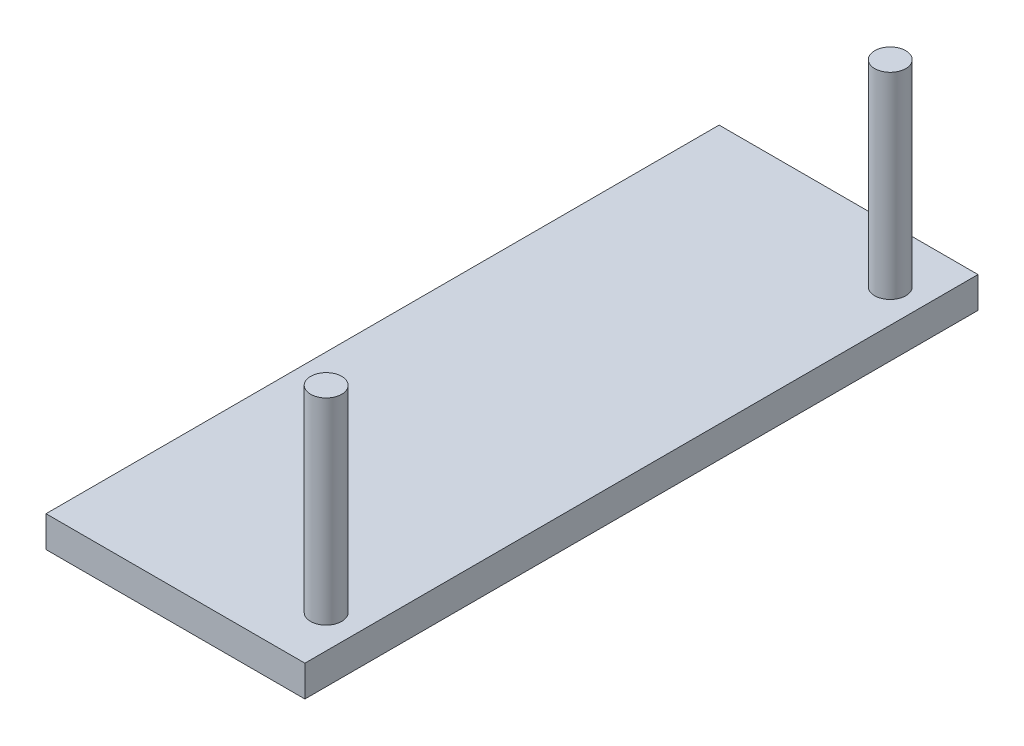
ISO-10303-21;
HEADER;
FILE_DESCRIPTION(('STEP AP214'),'2;1');
FILE_NAME('part.step','',(''),(''),'','','');
FILE_SCHEMA(('AUTOMOTIVE_DESIGN { 1 0 10303 214 1 1 1 1 }'));
ENDSEC;
DATA;
#1=APPLICATION_CONTEXT('core data for automotive mechanical design processes');
#2=APPLICATION_PROTOCOL_DEFINITION('international standard','automotive_design',2000,#1);
#3=PRODUCT_CONTEXT('',#1,'mechanical');
#4=PRODUCT('Part','Part','',(#3));
#5=PRODUCT_RELATED_PRODUCT_CATEGORY('part','',(#4));
#6=PRODUCT_DEFINITION_FORMATION('','',#4);
#7=PRODUCT_DEFINITION_CONTEXT('part definition',#1,'design');
#8=PRODUCT_DEFINITION('design','',#6,#7);
#9=PRODUCT_DEFINITION_SHAPE('','',#8);
#10=(LENGTH_UNIT() NAMED_UNIT(*) SI_UNIT(.MILLI.,.METRE.));
#11=(NAMED_UNIT(*) PLANE_ANGLE_UNIT() SI_UNIT($,.RADIAN.));
#12=(NAMED_UNIT(*) SI_UNIT($,.STERADIAN.) SOLID_ANGLE_UNIT());
#13=UNCERTAINTY_MEASURE_WITH_UNIT(LENGTH_MEASURE(1.E-05),#10,'distance_accuracy_value','');
#14=(GEOMETRIC_REPRESENTATION_CONTEXT(3) GLOBAL_UNCERTAINTY_ASSIGNED_CONTEXT((#13)) GLOBAL_UNIT_ASSIGNED_CONTEXT((#10,
#11,#12)) REPRESENTATION_CONTEXT('',''));
#15=CARTESIAN_POINT('',(0.,0.,0.));
#16=DIRECTION('',(0.,0.,1.));
#17=DIRECTION('',(1.,0.,0.));
#18=AXIS2_PLACEMENT_3D('',#15,#16,#17);
#19=CARTESIAN_POINT('',(12.5,3.,32.5));
#20=DIRECTION('',(-1.,0.,0.));
#21=DIRECTION('',(0.,0.,1.));
#22=AXIS2_PLACEMENT_3D('',#19,#20,#21);
#23=PLANE('',#22);
#24=DIRECTION('',(0.,0.,-1.));
#25=VECTOR('',#24,1.);
#26=CARTESIAN_POINT('',(12.5,0.,32.5));
#27=LINE('',#26,#25);
#28=CARTESIAN_POINT('',(12.5,0.,32.5));
#29=VERTEX_POINT('',#28);
#30=CARTESIAN_POINT('',(12.5,0.,-32.5));
#31=VERTEX_POINT('',#30);
#32=EDGE_CURVE('E100',#29,#31,#27,.T.);
#33=ORIENTED_EDGE('',*,*,#32,.T.);
#34=DIRECTION('',(0.,-1.,0.));
#35=VECTOR('',#34,1.);
#36=CARTESIAN_POINT('',(12.5,3.,-32.5));
#37=LINE('',#36,#35);
#38=CARTESIAN_POINT('',(12.5,3.,-32.5));
#39=VERTEX_POINT('',#38);
#40=EDGE_CURVE('E91',#39,#31,#37,.T.);
#41=ORIENTED_EDGE('',*,*,#40,.F.);
#42=DIRECTION('',(0.,0.,-1.));
#43=VECTOR('',#42,1.);
#44=CARTESIAN_POINT('',(12.5,3.,32.5));
#45=LINE('',#44,#43);
#46=CARTESIAN_POINT('',(12.5,3.,32.5));
#47=VERTEX_POINT('',#46);
#48=EDGE_CURVE('E85',#47,#39,#45,.T.);
#49=ORIENTED_EDGE('',*,*,#48,.F.);
#50=DIRECTION('',(0.,-1.,0.));
#51=VECTOR('',#50,1.);
#52=CARTESIAN_POINT('',(12.5,3.,32.5));
#53=LINE('',#52,#51);
#54=EDGE_CURVE('E96',#47,#29,#53,.T.);
#55=ORIENTED_EDGE('',*,*,#54,.T.);
#56=EDGE_LOOP('',(#33,#41,#49,#55));
#57=FACE_BOUND('',#56,.T.);
#58=ADVANCED_FACE('F33',(#57),#23,.F.);
#59=CARTESIAN_POINT('',(-12.5,3.,-32.5));
#60=DIRECTION('',(0.,0.,1.));
#61=DIRECTION('',(1.,0.,0.));
#62=AXIS2_PLACEMENT_3D('',#59,#60,#61);
#63=PLANE('',#62);
#64=DIRECTION('',(-1.,0.,0.));
#65=VECTOR('',#64,1.);
#66=CARTESIAN_POINT('',(-12.5,0.,-32.5));
#67=LINE('',#66,#65);
#68=CARTESIAN_POINT('',(-12.5,0.,-32.5));
#69=VERTEX_POINT('',#68);
#70=EDGE_CURVE('E90',#31,#69,#67,.T.);
#71=ORIENTED_EDGE('',*,*,#70,.T.);
#72=DIRECTION('',(0.,-1.,0.));
#73=VECTOR('',#72,1.);
#74=CARTESIAN_POINT('',(-12.5,3.,-32.5));
#75=LINE('',#74,#73);
#76=CARTESIAN_POINT('',(-12.5,3.,-32.5));
#77=VERTEX_POINT('',#76);
#78=EDGE_CURVE('E88',#77,#69,#75,.T.);
#79=ORIENTED_EDGE('',*,*,#78,.F.);
#80=DIRECTION('',(-1.,0.,0.));
#81=VECTOR('',#80,1.);
#82=CARTESIAN_POINT('',(-12.5,3.,-32.5));
#83=LINE('',#82,#81);
#84=EDGE_CURVE('E80',#39,#77,#83,.T.);
#85=ORIENTED_EDGE('',*,*,#84,.F.);
#86=ORIENTED_EDGE('',*,*,#40,.T.);
#87=EDGE_LOOP('',(#71,#79,#85,#86));
#88=FACE_BOUND('',#87,.T.);
#89=ADVANCED_FACE('F89',(#88),#63,.F.);
#90=CARTESIAN_POINT('',(-12.5,3.,32.5));
#91=DIRECTION('',(1.,0.,0.));
#92=DIRECTION('',(0.,0.,-1.));
#93=AXIS2_PLACEMENT_3D('',#90,#91,#92);
#94=PLANE('',#93);
#95=DIRECTION('',(0.,0.,1.));
#96=VECTOR('',#95,1.);
#97=CARTESIAN_POINT('',(-12.5,0.,32.5));
#98=LINE('',#97,#96);
#99=CARTESIAN_POINT('',(-12.5,0.,32.5));
#100=VERTEX_POINT('',#99);
#101=EDGE_CURVE('E66',#69,#100,#98,.T.);
#102=ORIENTED_EDGE('',*,*,#101,.T.);
#103=DIRECTION('',(0.,-1.,0.));
#104=VECTOR('',#103,1.);
#105=CARTESIAN_POINT('',(-12.5,3.,32.5));
#106=LINE('',#105,#104);
#107=CARTESIAN_POINT('',(-12.5,3.,32.5));
#108=VERTEX_POINT('',#107);
#109=EDGE_CURVE('E92',#108,#100,#106,.T.);
#110=ORIENTED_EDGE('',*,*,#109,.F.);
#111=DIRECTION('',(0.,0.,1.));
#112=VECTOR('',#111,1.);
#113=CARTESIAN_POINT('',(-12.5,3.,32.5));
#114=LINE('',#113,#112);
#115=EDGE_CURVE('E83',#77,#108,#114,.T.);
#116=ORIENTED_EDGE('',*,*,#115,.F.);
#117=ORIENTED_EDGE('',*,*,#78,.T.);
#118=EDGE_LOOP('',(#102,#110,#116,#117));
#119=FACE_BOUND('',#118,.T.);
#120=ADVANCED_FACE('F94',(#119),#94,.F.);
#121=CARTESIAN_POINT('',(-12.5,3.,32.5));
#122=DIRECTION('',(0.,0.,-1.));
#123=DIRECTION('',(-1.,0.,0.));
#124=AXIS2_PLACEMENT_3D('',#121,#122,#123);
#125=PLANE('',#124);
#126=DIRECTION('',(1.,0.,0.));
#127=VECTOR('',#126,1.);
#128=CARTESIAN_POINT('',(-12.5,0.,32.5));
#129=LINE('',#128,#127);
#130=EDGE_CURVE('E72',#100,#29,#129,.T.);
#131=ORIENTED_EDGE('',*,*,#130,.T.);
#132=ORIENTED_EDGE('',*,*,#54,.F.);
#133=DIRECTION('',(1.,0.,0.));
#134=VECTOR('',#133,1.);
#135=CARTESIAN_POINT('',(-12.5,3.,32.5));
#136=LINE('',#135,#134);
#137=EDGE_CURVE('E49',#108,#47,#136,.T.);
#138=ORIENTED_EDGE('',*,*,#137,.F.);
#139=ORIENTED_EDGE('',*,*,#109,.T.);
#140=EDGE_LOOP('',(#131,#132,#138,#139));
#141=FACE_BOUND('',#140,.T.);
#142=ADVANCED_FACE('F116',(#141),#125,.F.);
#143=CARTESIAN_POINT('',(0.,3.,0.));
#144=DIRECTION('',(0.,-1.,0.));
#145=DIRECTION('',(0.,0.,-1.));
#146=AXIS2_PLACEMENT_3D('',#143,#144,#145);
#147=PLANE('',#146);
#148=CARTESIAN_POINT('',(9.28966657312166,3.,27.2348939687972));
#149=DIRECTION('',(0.,-1.,0.));
#150=DIRECTION('',(0.,0.,-1.));
#151=AXIS2_PLACEMENT_3D('',#148,#149,#150);
#152=CIRCLE('',#151,1.5);
#153=CARTESIAN_POINT('',(9.28966657312166,3.,25.7348939687972));
#154=VERTEX_POINT('',#153);
#155=EDGE_CURVE('E11',#154,#154,#152,.F.);
#156=ORIENTED_EDGE('',*,*,#155,.F.);
#157=EDGE_LOOP('',(#156));
#158=FACE_BOUND('',#157,.T.);
#159=CARTESIAN_POINT('',(9.28966657312166,3.,-27.2348939687972));
#160=DIRECTION('',(0.,-1.,0.));
#161=DIRECTION('',(0.,0.,-1.));
#162=AXIS2_PLACEMENT_3D('',#159,#160,#161);
#163=CIRCLE('',#162,1.5);
#164=CARTESIAN_POINT('',(9.28966657312166,3.,-28.7348939687972));
#165=VERTEX_POINT('',#164);
#166=EDGE_CURVE('E41',#165,#165,#163,.F.);
#167=ORIENTED_EDGE('',*,*,#166,.F.);
#168=EDGE_LOOP('',(#167));
#169=FACE_BOUND('',#168,.T.);
#170=ORIENTED_EDGE('',*,*,#48,.T.);
#171=ORIENTED_EDGE('',*,*,#84,.T.);
#172=ORIENTED_EDGE('',*,*,#115,.T.);
#173=ORIENTED_EDGE('',*,*,#137,.T.);
#174=EDGE_LOOP('',(#170,#171,#172,#173));
#175=FACE_BOUND('',#174,.T.);
#176=ADVANCED_FACE('F81',(#158,#169,#175),#147,.F.);
#177=CARTESIAN_POINT('',(0.,0.,0.));
#178=DIRECTION('',(0.,-1.,0.));
#179=DIRECTION('',(0.,0.,-1.));
#180=AXIS2_PLACEMENT_3D('',#177,#178,#179);
#181=PLANE('',#180);
#182=ORIENTED_EDGE('',*,*,#32,.F.);
#183=ORIENTED_EDGE('',*,*,#130,.F.);
#184=ORIENTED_EDGE('',*,*,#101,.F.);
#185=ORIENTED_EDGE('',*,*,#70,.F.);
#186=EDGE_LOOP('',(#182,#183,#184,#185));
#187=FACE_BOUND('',#186,.T.);
#188=ADVANCED_FACE('F115',(#187),#181,.T.);
#189=CARTESIAN_POINT('',(9.28966657312166,22.,-27.2348939687972));
#190=DIRECTION('',(0.,-1.,0.));
#191=DIRECTION('',(0.,0.,-1.));
#192=AXIS2_PLACEMENT_3D('',#189,#190,#191);
#193=CYLINDRICAL_SURFACE('',#192,1.5);
#194=CARTESIAN_POINT('',(9.28966657312166,22.,-27.2348939687972));
#195=DIRECTION('',(0.,1.,0.));
#196=DIRECTION('',(0.,0.,1.));
#197=AXIS2_PLACEMENT_3D('',#194,#195,#196);
#198=CIRCLE('',#197,1.5);
#199=CARTESIAN_POINT('',(9.28966657312166,22.,-25.7348939687972));
#200=VERTEX_POINT('',#199);
#201=EDGE_CURVE('E103',#200,#200,#198,.T.);
#202=ORIENTED_EDGE('',*,*,#201,.F.);
#203=EDGE_LOOP('',(#202));
#204=FACE_BOUND('',#203,.T.);
#205=ORIENTED_EDGE('',*,*,#166,.T.);
#206=EDGE_LOOP('',(#205));
#207=FACE_BOUND('',#206,.T.);
#208=ADVANCED_FACE('F112',(#204,#207),#193,.T.);
#209=CARTESIAN_POINT('',(9.28966657312166,22.,-27.2348939687972));
#210=DIRECTION('',(0.,1.,0.));
#211=DIRECTION('',(0.,0.,1.));
#212=AXIS2_PLACEMENT_3D('',#209,#210,#211);
#213=PLANE('',#212);
#214=ORIENTED_EDGE('',*,*,#201,.T.);
#215=EDGE_LOOP('',(#214));
#216=FACE_BOUND('',#215,.T.);
#217=ADVANCED_FACE('F146',(#216),#213,.T.);
#218=CARTESIAN_POINT('',(9.28966657312166,22.,27.2348939687972));
#219=DIRECTION('',(0.,-1.,0.));
#220=DIRECTION('',(0.,0.,-1.));
#221=AXIS2_PLACEMENT_3D('',#218,#219,#220);
#222=CYLINDRICAL_SURFACE('',#221,1.5);
#223=CARTESIAN_POINT('',(9.28966657312166,22.,27.2348939687972));
#224=DIRECTION('',(0.,1.,0.));
#225=DIRECTION('',(0.,0.,1.));
#226=AXIS2_PLACEMENT_3D('',#223,#224,#225);
#227=CIRCLE('',#226,1.5);
#228=CARTESIAN_POINT('',(9.28966657312166,22.,28.7348939687972));
#229=VERTEX_POINT('',#228);
#230=EDGE_CURVE('E137',#229,#229,#227,.T.);
#231=ORIENTED_EDGE('',*,*,#230,.F.);
#232=EDGE_LOOP('',(#231));
#233=FACE_BOUND('',#232,.T.);
#234=ORIENTED_EDGE('',*,*,#155,.T.);
#235=EDGE_LOOP('',(#234));
#236=FACE_BOUND('',#235,.T.);
#237=ADVANCED_FACE('F143',(#233,#236),#222,.T.);
#238=CARTESIAN_POINT('',(9.28966657312166,22.,27.2348939687972));
#239=DIRECTION('',(0.,1.,0.));
#240=DIRECTION('',(0.,0.,1.));
#241=AXIS2_PLACEMENT_3D('',#238,#239,#240);
#242=PLANE('',#241);
#243=ORIENTED_EDGE('',*,*,#230,.T.);
#244=EDGE_LOOP('',(#243));
#245=FACE_BOUND('',#244,.T.);
#246=ADVANCED_FACE('F141',(#245),#242,.T.);
#247=CLOSED_SHELL('',(#58,#89,#120,#142,#176,#188,#208,#217,#237,#246));
#248=MANIFOLD_SOLID_BREP('B2',#247);
#249=ADVANCED_BREP_SHAPE_REPRESENTATION('',(#18,#248),#14);
#250=SHAPE_DEFINITION_REPRESENTATION(#9,#249);
ENDSEC;
END-ISO-10303-21;
